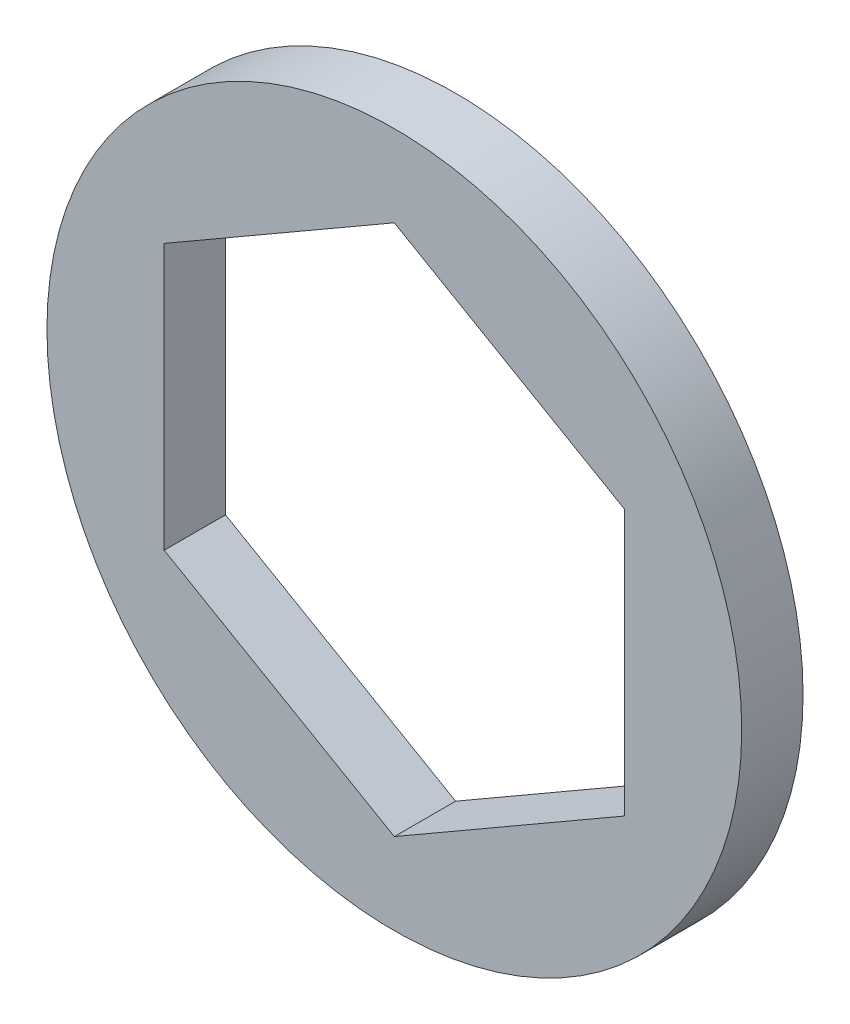
ISO-10303-21;
HEADER;
FILE_DESCRIPTION(('STEP AP214'),'2;1');
FILE_NAME('part.step','',(''),(''),'','','');
FILE_SCHEMA(('AUTOMOTIVE_DESIGN { 1 0 10303 214 1 1 1 1 }'));
ENDSEC;
DATA;
#1=APPLICATION_CONTEXT('core data for automotive mechanical design processes');
#2=APPLICATION_PROTOCOL_DEFINITION('international standard','automotive_design',2000,#1);
#3=PRODUCT_CONTEXT('',#1,'mechanical');
#4=PRODUCT('Part','Part','',(#3));
#5=PRODUCT_RELATED_PRODUCT_CATEGORY('part','',(#4));
#6=PRODUCT_DEFINITION_FORMATION('','',#4);
#7=PRODUCT_DEFINITION_CONTEXT('part definition',#1,'design');
#8=PRODUCT_DEFINITION('design','',#6,#7);
#9=PRODUCT_DEFINITION_SHAPE('','',#8);
#10=(LENGTH_UNIT() NAMED_UNIT(*) SI_UNIT(.MILLI.,.METRE.));
#11=(NAMED_UNIT(*) PLANE_ANGLE_UNIT() SI_UNIT($,.RADIAN.));
#12=(NAMED_UNIT(*) SI_UNIT($,.STERADIAN.) SOLID_ANGLE_UNIT());
#13=UNCERTAINTY_MEASURE_WITH_UNIT(LENGTH_MEASURE(1.E-05),#10,'distance_accuracy_value','');
#14=(GEOMETRIC_REPRESENTATION_CONTEXT(3) GLOBAL_UNCERTAINTY_ASSIGNED_CONTEXT((#13)) GLOBAL_UNIT_ASSIGNED_CONTEXT((#10,
#11,#12)) REPRESENTATION_CONTEXT('',''));
#15=CARTESIAN_POINT('',(0.,0.,0.));
#16=DIRECTION('',(0.,0.,1.));
#17=DIRECTION('',(1.,0.,0.));
#18=AXIS2_PLACEMENT_3D('',#15,#16,#17);
#19=CARTESIAN_POINT('',(0.,0.,1.793500096));
#20=DIRECTION('',(0.,0.,1.));
#21=DIRECTION('',(1.,0.,0.));
#22=AXIS2_PLACEMENT_3D('',#19,#20,#21);
#23=PLANE('',#22);
#24=CARTESIAN_POINT('',(0.,0.,1.793500096));
#25=DIRECTION('',(0.,0.,1.));
#26=DIRECTION('',(1.,0.,0.));
#27=AXIS2_PLACEMENT_3D('',#24,#25,#26);
#28=CIRCLE('',#27,10.16);
#29=CARTESIAN_POINT('',(10.16,0.,1.793500096));
#30=VERTEX_POINT('',#29);
#31=EDGE_CURVE('E11',#30,#30,#28,.T.);
#32=ORIENTED_EDGE('',*,*,#31,.T.);
#33=EDGE_LOOP('',(#32));
#34=FACE_BOUND('',#33,.T.);
#35=DIRECTION('',(-0.866025403784439,0.5,0.));
#36=VECTOR('',#35,1.);
#37=CARTESIAN_POINT('',(6.731,3.88614466191537,1.793500096));
#38=LINE('',#37,#36);
#39=CARTESIAN_POINT('',(6.731,3.88614466191537,1.793500096));
#40=VERTEX_POINT('',#39);
#41=CARTESIAN_POINT('',(0.,7.77228932383074,1.793500096));
#42=VERTEX_POINT('',#41);
#43=EDGE_CURVE('E100',#40,#42,#38,.T.);
#44=ORIENTED_EDGE('',*,*,#43,.F.);
#45=DIRECTION('',(0.,1.,0.));
#46=VECTOR('',#45,1.);
#47=CARTESIAN_POINT('',(6.731,-3.88614466191537,1.793500096));
#48=LINE('',#47,#46);
#49=CARTESIAN_POINT('',(6.731,-3.88614466191537,1.793500096));
#50=VERTEX_POINT('',#49);
#51=EDGE_CURVE('E92',#50,#40,#48,.T.);
#52=ORIENTED_EDGE('',*,*,#51,.F.);
#53=DIRECTION('',(0.866025403784439,0.5,0.));
#54=VECTOR('',#53,1.);
#55=CARTESIAN_POINT('',(0.,-7.77228932383074,1.793500096));
#56=LINE('',#55,#54);
#57=CARTESIAN_POINT('',(0.,-7.77228932383074,1.793500096));
#58=VERTEX_POINT('',#57);
#59=EDGE_CURVE('E120',#58,#50,#56,.T.);
#60=ORIENTED_EDGE('',*,*,#59,.F.);
#61=DIRECTION('',(0.866025403784439,-0.5,0.));
#62=VECTOR('',#61,1.);
#63=CARTESIAN_POINT('',(-6.731,-3.88614466191537,1.793500096));
#64=LINE('',#63,#62);
#65=CARTESIAN_POINT('',(-6.731,-3.88614466191537,1.793500096));
#66=VERTEX_POINT('',#65);
#67=EDGE_CURVE('E118',#66,#58,#64,.T.);
#68=ORIENTED_EDGE('',*,*,#67,.F.);
#69=DIRECTION('',(0.,-1.,0.));
#70=VECTOR('',#69,1.);
#71=CARTESIAN_POINT('',(-6.731,3.88614466191537,1.793500096));
#72=LINE('',#71,#70);
#73=CARTESIAN_POINT('',(-6.731,3.88614466191537,1.793500096));
#74=VERTEX_POINT('',#73);
#75=EDGE_CURVE('E114',#74,#66,#72,.T.);
#76=ORIENTED_EDGE('',*,*,#75,.F.);
#77=DIRECTION('',(-0.866025403784439,-0.5,0.));
#78=VECTOR('',#77,1.);
#79=CARTESIAN_POINT('',(0.,7.77228932383074,1.793500096));
#80=LINE('',#79,#78);
#81=EDGE_CURVE('E112',#42,#74,#80,.T.);
#82=ORIENTED_EDGE('',*,*,#81,.F.);
#83=EDGE_LOOP('',(#44,#52,#60,#68,#76,#82));
#84=FACE_BOUND('',#83,.T.);
#85=ADVANCED_FACE('F39',(#34,#84),#23,.T.);
#86=CARTESIAN_POINT('',(0.,0.,0.));
#87=DIRECTION('',(0.,0.,1.));
#88=DIRECTION('',(1.,0.,0.));
#89=AXIS2_PLACEMENT_3D('',#86,#87,#88);
#90=PLANE('',#89);
#91=CARTESIAN_POINT('',(0.,0.,0.));
#92=DIRECTION('',(0.,0.,1.));
#93=DIRECTION('',(1.,0.,0.));
#94=AXIS2_PLACEMENT_3D('',#91,#92,#93);
#95=CIRCLE('',#94,10.16);
#96=CARTESIAN_POINT('',(10.16,0.,0.));
#97=VERTEX_POINT('',#96);
#98=EDGE_CURVE('E43',#97,#97,#95,.T.);
#99=ORIENTED_EDGE('',*,*,#98,.F.);
#100=EDGE_LOOP('',(#99));
#101=FACE_BOUND('',#100,.T.);
#102=DIRECTION('',(0.,1.,0.));
#103=VECTOR('',#102,1.);
#104=CARTESIAN_POINT('',(6.731,-3.88614466191537,0.));
#105=LINE('',#104,#103);
#106=CARTESIAN_POINT('',(6.731,-3.88614466191537,0.));
#107=VERTEX_POINT('',#106);
#108=CARTESIAN_POINT('',(6.731,3.88614466191537,0.));
#109=VERTEX_POINT('',#108);
#110=EDGE_CURVE('E62',#107,#109,#105,.T.);
#111=ORIENTED_EDGE('',*,*,#110,.T.);
#112=DIRECTION('',(-0.866025403784439,0.5,0.));
#113=VECTOR('',#112,1.);
#114=CARTESIAN_POINT('',(6.731,3.88614466191537,0.));
#115=LINE('',#114,#113);
#116=CARTESIAN_POINT('',(0.,7.77228932383074,0.));
#117=VERTEX_POINT('',#116);
#118=EDGE_CURVE('E107',#109,#117,#115,.T.);
#119=ORIENTED_EDGE('',*,*,#118,.T.);
#120=DIRECTION('',(-0.866025403784439,-0.5,0.));
#121=VECTOR('',#120,1.);
#122=CARTESIAN_POINT('',(0.,7.77228932383074,0.));
#123=LINE('',#122,#121);
#124=CARTESIAN_POINT('',(-6.731,3.88614466191537,0.));
#125=VERTEX_POINT('',#124);
#126=EDGE_CURVE('E124',#117,#125,#123,.T.);
#127=ORIENTED_EDGE('',*,*,#126,.T.);
#128=DIRECTION('',(0.,-1.,0.));
#129=VECTOR('',#128,1.);
#130=CARTESIAN_POINT('',(-6.731,3.88614466191537,0.));
#131=LINE('',#130,#129);
#132=CARTESIAN_POINT('',(-6.731,-3.88614466191537,0.));
#133=VERTEX_POINT('',#132);
#134=EDGE_CURVE('E127',#125,#133,#131,.T.);
#135=ORIENTED_EDGE('',*,*,#134,.T.);
#136=DIRECTION('',(0.866025403784439,-0.5,0.));
#137=VECTOR('',#136,1.);
#138=CARTESIAN_POINT('',(-6.731,-3.88614466191537,0.));
#139=LINE('',#138,#137);
#140=CARTESIAN_POINT('',(0.,-7.77228932383074,0.));
#141=VERTEX_POINT('',#140);
#142=EDGE_CURVE('E130',#133,#141,#139,.T.);
#143=ORIENTED_EDGE('',*,*,#142,.T.);
#144=DIRECTION('',(0.866025403784439,0.5,0.));
#145=VECTOR('',#144,1.);
#146=CARTESIAN_POINT('',(0.,-7.77228932383074,0.));
#147=LINE('',#146,#145);
#148=EDGE_CURVE('E101',#141,#107,#147,.T.);
#149=ORIENTED_EDGE('',*,*,#148,.T.);
#150=EDGE_LOOP('',(#111,#119,#127,#135,#143,#149));
#151=FACE_BOUND('',#150,.T.);
#152=ADVANCED_FACE('F147',(#101,#151),#90,.F.);
#153=CARTESIAN_POINT('',(0.,0.,1.793500096));
#154=DIRECTION('',(0.,0.,-1.));
#155=DIRECTION('',(-1.,0.,0.));
#156=AXIS2_PLACEMENT_3D('',#153,#154,#155);
#157=CYLINDRICAL_SURFACE('',#156,10.16);
#158=ORIENTED_EDGE('',*,*,#31,.F.);
#159=EDGE_LOOP('',(#158));
#160=FACE_BOUND('',#159,.T.);
#161=ORIENTED_EDGE('',*,*,#98,.T.);
#162=EDGE_LOOP('',(#161));
#163=FACE_BOUND('',#162,.T.);
#164=ADVANCED_FACE('F41',(#160,#163),#157,.T.);
#165=CARTESIAN_POINT('',(6.731,-3.88614466191537,1.793500096));
#166=DIRECTION('',(-1.,0.,0.));
#167=DIRECTION('',(0.,-1.,0.));
#168=AXIS2_PLACEMENT_3D('',#165,#166,#167);
#169=PLANE('',#168);
#170=ORIENTED_EDGE('',*,*,#110,.F.);
#171=DIRECTION('',(0.,0.,-1.));
#172=VECTOR('',#171,1.);
#173=CARTESIAN_POINT('',(6.731,-3.88614466191537,1.793500096));
#174=LINE('',#173,#172);
#175=EDGE_CURVE('E96',#50,#107,#174,.T.);
#176=ORIENTED_EDGE('',*,*,#175,.F.);
#177=ORIENTED_EDGE('',*,*,#51,.T.);
#178=DIRECTION('',(0.,0.,-1.));
#179=VECTOR('',#178,1.);
#180=CARTESIAN_POINT('',(6.731,3.88614466191537,1.793500096));
#181=LINE('',#180,#179);
#182=EDGE_CURVE('E95',#40,#109,#181,.T.);
#183=ORIENTED_EDGE('',*,*,#182,.T.);
#184=EDGE_LOOP('',(#170,#176,#177,#183));
#185=FACE_BOUND('',#184,.T.);
#186=ADVANCED_FACE('F94',(#185),#169,.T.);
#187=CARTESIAN_POINT('',(6.731,3.88614466191537,1.793500096));
#188=DIRECTION('',(-0.5,-0.866025403784439,0.));
#189=DIRECTION('',(0.866025403784439,-0.5,0.));
#190=AXIS2_PLACEMENT_3D('',#187,#188,#189);
#191=PLANE('',#190);
#192=ORIENTED_EDGE('',*,*,#118,.F.);
#193=ORIENTED_EDGE('',*,*,#182,.F.);
#194=ORIENTED_EDGE('',*,*,#43,.T.);
#195=DIRECTION('',(0.,0.,-1.));
#196=VECTOR('',#195,1.);
#197=CARTESIAN_POINT('',(0.,7.77228932383074,1.793500096));
#198=LINE('',#197,#196);
#199=EDGE_CURVE('E108',#42,#117,#198,.T.);
#200=ORIENTED_EDGE('',*,*,#199,.T.);
#201=EDGE_LOOP('',(#192,#193,#194,#200));
#202=FACE_BOUND('',#201,.T.);
#203=ADVANCED_FACE('F104',(#202),#191,.T.);
#204=CARTESIAN_POINT('',(0.,7.77228932383074,1.793500096));
#205=DIRECTION('',(0.5,-0.866025403784439,0.));
#206=DIRECTION('',(0.866025403784439,0.5,0.));
#207=AXIS2_PLACEMENT_3D('',#204,#205,#206);
#208=PLANE('',#207);
#209=ORIENTED_EDGE('',*,*,#126,.F.);
#210=ORIENTED_EDGE('',*,*,#199,.F.);
#211=ORIENTED_EDGE('',*,*,#81,.T.);
#212=DIRECTION('',(0.,0.,-1.));
#213=VECTOR('',#212,1.);
#214=CARTESIAN_POINT('',(-6.731,3.88614466191537,1.793500096));
#215=LINE('',#214,#213);
#216=EDGE_CURVE('E139',#74,#125,#215,.T.);
#217=ORIENTED_EDGE('',*,*,#216,.T.);
#218=EDGE_LOOP('',(#209,#210,#211,#217));
#219=FACE_BOUND('',#218,.T.);
#220=ADVANCED_FACE('F143',(#219),#208,.T.);
#221=CARTESIAN_POINT('',(-6.731,3.88614466191537,1.793500096));
#222=DIRECTION('',(1.,0.,0.));
#223=DIRECTION('',(0.,1.,0.));
#224=AXIS2_PLACEMENT_3D('',#221,#222,#223);
#225=PLANE('',#224);
#226=ORIENTED_EDGE('',*,*,#134,.F.);
#227=ORIENTED_EDGE('',*,*,#216,.F.);
#228=ORIENTED_EDGE('',*,*,#75,.T.);
#229=DIRECTION('',(0.,0.,-1.));
#230=VECTOR('',#229,1.);
#231=CARTESIAN_POINT('',(-6.731,-3.88614466191537,1.793500096));
#232=LINE('',#231,#230);
#233=EDGE_CURVE('E137',#66,#133,#232,.T.);
#234=ORIENTED_EDGE('',*,*,#233,.T.);
#235=EDGE_LOOP('',(#226,#227,#228,#234));
#236=FACE_BOUND('',#235,.T.);
#237=ADVANCED_FACE('F155',(#236),#225,.T.);
#238=CARTESIAN_POINT('',(-6.731,-3.88614466191537,1.793500096));
#239=DIRECTION('',(0.5,0.866025403784439,0.));
#240=DIRECTION('',(-0.866025403784439,0.5,0.));
#241=AXIS2_PLACEMENT_3D('',#238,#239,#240);
#242=PLANE('',#241);
#243=ORIENTED_EDGE('',*,*,#142,.F.);
#244=ORIENTED_EDGE('',*,*,#233,.F.);
#245=ORIENTED_EDGE('',*,*,#67,.T.);
#246=DIRECTION('',(0.,0.,-1.));
#247=VECTOR('',#246,1.);
#248=CARTESIAN_POINT('',(0.,-7.77228932383074,1.793500096));
#249=LINE('',#248,#247);
#250=EDGE_CURVE('E54',#58,#141,#249,.T.);
#251=ORIENTED_EDGE('',*,*,#250,.T.);
#252=EDGE_LOOP('',(#243,#244,#245,#251));
#253=FACE_BOUND('',#252,.T.);
#254=ADVANCED_FACE('F153',(#253),#242,.T.);
#255=CARTESIAN_POINT('',(0.,-7.77228932383074,1.793500096));
#256=DIRECTION('',(-0.5,0.866025403784439,0.));
#257=DIRECTION('',(-0.866025403784439,-0.5,0.));
#258=AXIS2_PLACEMENT_3D('',#255,#256,#257);
#259=PLANE('',#258);
#260=ORIENTED_EDGE('',*,*,#148,.F.);
#261=ORIENTED_EDGE('',*,*,#250,.F.);
#262=ORIENTED_EDGE('',*,*,#59,.T.);
#263=ORIENTED_EDGE('',*,*,#175,.T.);
#264=EDGE_LOOP('',(#260,#261,#262,#263));
#265=FACE_BOUND('',#264,.T.);
#266=ADVANCED_FACE('F149',(#265),#259,.T.);
#267=CLOSED_SHELL('',(#85,#152,#164,#186,#203,#220,#237,#254,#266));
#268=MANIFOLD_SOLID_BREP('B2',#267);
#269=ADVANCED_BREP_SHAPE_REPRESENTATION('',(#18,#268),#14);
#270=SHAPE_DEFINITION_REPRESENTATION(#9,#269);
ENDSEC;
END-ISO-10303-21;
